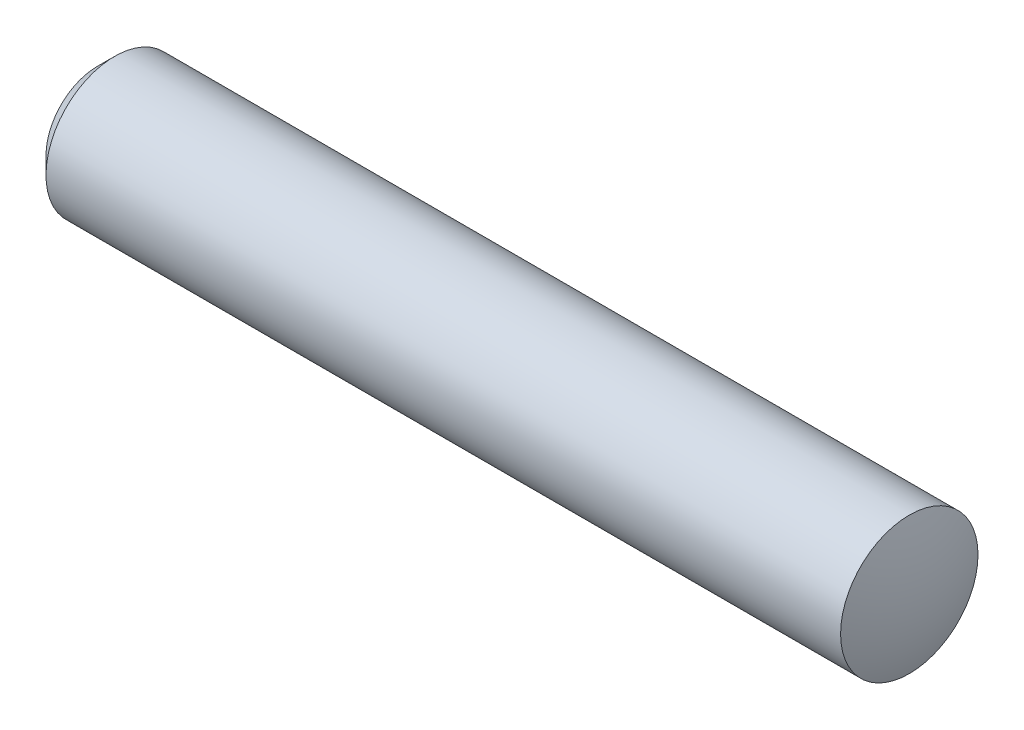
ISO-10303-21;
HEADER;
FILE_DESCRIPTION(('STEP AP214'),'2;1');
FILE_NAME('part.step','',(''),(''),'','','');
FILE_SCHEMA(('AUTOMOTIVE_DESIGN { 1 0 10303 214 1 1 1 1 }'));
ENDSEC;
DATA;
#1=APPLICATION_CONTEXT('core data for automotive mechanical design processes');
#2=APPLICATION_PROTOCOL_DEFINITION('international standard','automotive_design',2000,#1);
#3=PRODUCT_CONTEXT('',#1,'mechanical');
#4=PRODUCT('Part','Part','',(#3));
#5=PRODUCT_RELATED_PRODUCT_CATEGORY('part','',(#4));
#6=PRODUCT_DEFINITION_FORMATION('','',#4);
#7=PRODUCT_DEFINITION_CONTEXT('part definition',#1,'design');
#8=PRODUCT_DEFINITION('design','',#6,#7);
#9=PRODUCT_DEFINITION_SHAPE('','',#8);
#10=(LENGTH_UNIT() NAMED_UNIT(*) SI_UNIT(.MILLI.,.METRE.));
#11=(NAMED_UNIT(*) PLANE_ANGLE_UNIT() SI_UNIT($,.RADIAN.));
#12=(NAMED_UNIT(*) SI_UNIT($,.STERADIAN.) SOLID_ANGLE_UNIT());
#13=UNCERTAINTY_MEASURE_WITH_UNIT(LENGTH_MEASURE(1.E-05),#10,'distance_accuracy_value','');
#14=(GEOMETRIC_REPRESENTATION_CONTEXT(3) GLOBAL_UNCERTAINTY_ASSIGNED_CONTEXT((#13)) GLOBAL_UNIT_ASSIGNED_CONTEXT((#10,
#11,#12)) REPRESENTATION_CONTEXT('',''));
#15=CARTESIAN_POINT('',(0.,0.,0.));
#16=DIRECTION('',(0.,0.,1.));
#17=DIRECTION('',(1.,0.,0.));
#18=AXIS2_PLACEMENT_3D('',#15,#16,#17);
#19=CARTESIAN_POINT('',(-17.4976841920432,0.,0.));
#20=DIRECTION('',(-1.,0.,0.));
#21=DIRECTION('',(0.,1.,0.));
#22=AXIS2_PLACEMENT_3D('',#19,#20,#21);
#23=SPHERICAL_SURFACE('',#22,5.6);
#24=CARTESIAN_POINT('',(-12.1023158079568,0.,0.));
#25=DIRECTION('',(-1.,0.,0.));
#26=DIRECTION('',(0.,-1.,0.));
#27=AXIS2_PLACEMENT_3D('',#24,#25,#26);
#28=CIRCLE('',#27,1.5);
#29=CARTESIAN_POINT('',(-12.1023158079568,-1.5,0.));
#30=VERTEX_POINT('',#29);
#31=EDGE_CURVE('E10',#30,#30,#28,.T.);
#32=ORIENTED_EDGE('',*,*,#31,.T.);
#33=EDGE_LOOP('',(#32));
#34=FACE_BOUND('',#33,.T.);
#35=ADVANCED_FACE('F32',(#34),#23,.F.);
#36=CARTESIAN_POINT('',(-11.6023158079568,0.,0.));
#37=DIRECTION('',(1.,0.,0.));
#38=DIRECTION('',(0.,1.,0.));
#39=AXIS2_PLACEMENT_3D('',#36,#37,#38);
#40=CONICAL_SURFACE('',#39,2.,0.785398163397447);
#41=ORIENTED_EDGE('',*,*,#31,.F.);
#42=EDGE_LOOP('',(#41));
#43=FACE_BOUND('',#42,.T.);
#44=CARTESIAN_POINT('',(-11.6023158079568,0.,0.));
#45=DIRECTION('',(-1.,0.,0.));
#46=DIRECTION('',(0.,-1.,0.));
#47=AXIS2_PLACEMENT_3D('',#44,#45,#46);
#48=CIRCLE('',#47,2.);
#49=CARTESIAN_POINT('',(-11.6023158079568,-1.99999999999999,0.));
#50=VERTEX_POINT('',#49);
#51=EDGE_CURVE('E38',#50,#50,#48,.T.);
#52=ORIENTED_EDGE('',*,*,#51,.T.);
#53=EDGE_LOOP('',(#52));
#54=FACE_BOUND('',#53,.T.);
#55=ADVANCED_FACE('F57',(#43,#54),#40,.T.);
#56=CARTESIAN_POINT('',(-11.8976841920432,0.,0.));
#57=DIRECTION('',(-1.,0.,0.));
#58=DIRECTION('',(0.,-1.,0.));
#59=AXIS2_PLACEMENT_3D('',#56,#57,#58);
#60=CYLINDRICAL_SURFACE('',#59,2.);
#61=ORIENTED_EDGE('',*,*,#51,.F.);
#62=EDGE_LOOP('',(#61));
#63=FACE_BOUND('',#62,.T.);
#64=CARTESIAN_POINT('',(11.5283629242921,0.,0.));
#65=DIRECTION('',(-1.,0.,0.));
#66=DIRECTION('',(0.,-1.,0.));
#67=AXIS2_PLACEMENT_3D('',#64,#65,#66);
#68=CIRCLE('',#67,2.);
#69=CARTESIAN_POINT('',(11.5283629242921,-2.,0.));
#70=VERTEX_POINT('',#69);
#71=EDGE_CURVE('E42',#70,#70,#68,.T.);
#72=ORIENTED_EDGE('',*,*,#71,.T.);
#73=EDGE_LOOP('',(#72));
#74=FACE_BOUND('',#73,.T.);
#75=ADVANCED_FACE('F49',(#63,#74),#60,.T.);
#76=CARTESIAN_POINT('',(6.29768419204324,0.,0.));
#77=DIRECTION('',(-1.,0.,0.));
#78=DIRECTION('',(0.,1.,0.));
#79=AXIS2_PLACEMENT_3D('',#76,#77,#78);
#80=SPHERICAL_SURFACE('',#79,5.6);
#81=ORIENTED_EDGE('',*,*,#71,.F.);
#82=EDGE_LOOP('',(#81));
#83=FACE_BOUND('',#82,.T.);
#84=ADVANCED_FACE('F51',(#83),#80,.T.);
#85=CLOSED_SHELL('',(#35,#55,#75,#84));
#86=MANIFOLD_SOLID_BREP('B2',#85);
#87=ADVANCED_BREP_SHAPE_REPRESENTATION('',(#18,#86),#14);
#88=SHAPE_DEFINITION_REPRESENTATION(#9,#87);
ENDSEC;
END-ISO-10303-21;
